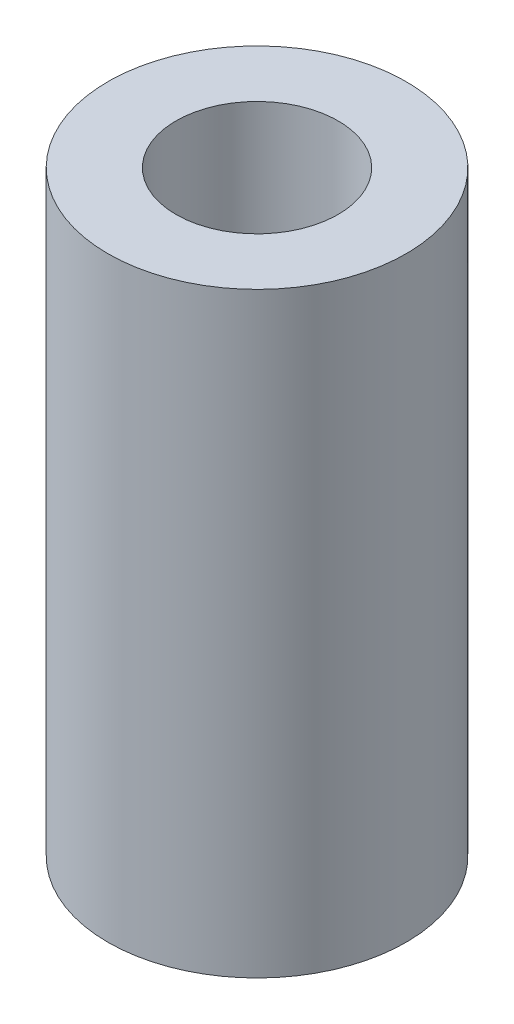
ISO-10303-21;
HEADER;
FILE_DESCRIPTION(('STEP AP214'),'2;1');
FILE_NAME('part.step','',(''),(''),'','','');
FILE_SCHEMA(('AUTOMOTIVE_DESIGN { 1 0 10303 214 1 1 1 1 }'));
ENDSEC;
DATA;
#1=APPLICATION_CONTEXT('core data for automotive mechanical design processes');
#2=APPLICATION_PROTOCOL_DEFINITION('international standard','automotive_design',2000,#1);
#3=PRODUCT_CONTEXT('',#1,'mechanical');
#4=PRODUCT('Part','Part','',(#3));
#5=PRODUCT_RELATED_PRODUCT_CATEGORY('part','',(#4));
#6=PRODUCT_DEFINITION_FORMATION('','',#4);
#7=PRODUCT_DEFINITION_CONTEXT('part definition',#1,'design');
#8=PRODUCT_DEFINITION('design','',#6,#7);
#9=PRODUCT_DEFINITION_SHAPE('','',#8);
#10=(LENGTH_UNIT() NAMED_UNIT(*) SI_UNIT(.MILLI.,.METRE.));
#11=(NAMED_UNIT(*) PLANE_ANGLE_UNIT() SI_UNIT($,.RADIAN.));
#12=(NAMED_UNIT(*) SI_UNIT($,.STERADIAN.) SOLID_ANGLE_UNIT());
#13=UNCERTAINTY_MEASURE_WITH_UNIT(LENGTH_MEASURE(1.E-05),#10,'distance_accuracy_value','');
#14=(GEOMETRIC_REPRESENTATION_CONTEXT(3) GLOBAL_UNCERTAINTY_ASSIGNED_CONTEXT((#13)) GLOBAL_UNIT_ASSIGNED_CONTEXT((#10,
#11,#12)) REPRESENTATION_CONTEXT('',''));
#15=CARTESIAN_POINT('',(0.,0.,0.));
#16=DIRECTION('',(0.,0.,1.));
#17=DIRECTION('',(1.,0.,0.));
#18=AXIS2_PLACEMENT_3D('',#15,#16,#17);
#19=CARTESIAN_POINT('',(0.,12.7,0.));
#20=DIRECTION('',(0.,-1.,0.));
#21=DIRECTION('',(0.,0.,-1.));
#22=AXIS2_PLACEMENT_3D('',#19,#20,#21);
#23=CYLINDRICAL_SURFACE('',#22,3.175);
#24=CARTESIAN_POINT('',(0.,12.7,0.));
#25=DIRECTION('',(0.,1.,0.));
#26=DIRECTION('',(0.,0.,1.));
#27=AXIS2_PLACEMENT_3D('',#24,#25,#26);
#28=CIRCLE('',#27,3.175);
#29=CARTESIAN_POINT('',(0.,12.7,3.175));
#30=VERTEX_POINT('',#29);
#31=EDGE_CURVE('E10',#30,#30,#28,.T.);
#32=ORIENTED_EDGE('',*,*,#31,.F.);
#33=EDGE_LOOP('',(#32));
#34=FACE_BOUND('',#33,.T.);
#35=CARTESIAN_POINT('',(0.,0.,0.));
#36=DIRECTION('',(0.,1.,0.));
#37=DIRECTION('',(0.,0.,1.));
#38=AXIS2_PLACEMENT_3D('',#35,#36,#37);
#39=CIRCLE('',#38,3.175);
#40=CARTESIAN_POINT('',(0.,0.,3.175));
#41=VERTEX_POINT('',#40);
#42=EDGE_CURVE('E44',#41,#41,#39,.T.);
#43=ORIENTED_EDGE('',*,*,#42,.T.);
#44=EDGE_LOOP('',(#43));
#45=FACE_BOUND('',#44,.T.);
#46=ADVANCED_FACE('F40',(#34,#45),#23,.T.);
#47=CARTESIAN_POINT('',(0.,12.7,0.));
#48=DIRECTION('',(0.,1.,0.));
#49=DIRECTION('',(0.,0.,1.));
#50=AXIS2_PLACEMENT_3D('',#47,#48,#49);
#51=PLANE('',#50);
#52=CARTESIAN_POINT('',(0.,12.700012,0.));
#53=DIRECTION('',(0.,1.,0.));
#54=DIRECTION('',(0.,0.,1.));
#55=AXIS2_PLACEMENT_3D('',#52,#53,#54);
#56=CIRCLE('',#55,1.7272);
#57=CARTESIAN_POINT('',(0.,12.700012,1.7272));
#58=VERTEX_POINT('',#57);
#59=EDGE_CURVE('E49',#58,#58,#56,.T.);
#60=ORIENTED_EDGE('',*,*,#59,.F.);
#61=EDGE_LOOP('',(#60));
#62=FACE_BOUND('',#61,.T.);
#63=ORIENTED_EDGE('',*,*,#31,.T.);
#64=EDGE_LOOP('',(#63));
#65=FACE_BOUND('',#64,.T.);
#66=ADVANCED_FACE('F66',(#62,#65),#51,.T.);
#67=CARTESIAN_POINT('',(0.,0.,0.));
#68=DIRECTION('',(0.,1.,0.));
#69=DIRECTION('',(0.,0.,1.));
#70=AXIS2_PLACEMENT_3D('',#67,#68,#69);
#71=PLANE('',#70);
#72=CARTESIAN_POINT('',(0.,0.,1.7272));
#73=CARTESIAN_POINT('',(0.028484275537845,0.,1.72720220619767));
#74=CARTESIAN_POINT('',(0.0569699872239295,0.,1.72652120642082));
#75=CARTESIAN_POINT('',(0.113673965070922,0.,1.72377986229577));
#76=CARTESIAN_POINT('',(0.141892703474904,0.,1.72172924953787));
#77=CARTESIAN_POINT('',(0.198063089875864,0.,1.71624920257882));
#78=CARTESIAN_POINT('',(0.226015369805878,0.,1.71282627006574));
#79=CARTESIAN_POINT('',(0.281652520269238,0.,1.70460561640287));
#80=CARTESIAN_POINT('',(0.309337852608635,0.,1.69981102202466));
#81=CARTESIAN_POINT('',(0.364441385642307,0.,1.68885025387632));
#82=CARTESIAN_POINT('',(0.391859532188237,0.,1.68268380787975));
#83=CARTESIAN_POINT('',(0.446429292224726,0.,1.66898292472));
#84=CARTESIAN_POINT('',(0.473580001915824,0.,1.66144488967167));
#85=CARTESIAN_POINT('',(0.527615675721411,0.,1.64500367419892));
#86=CARTESIAN_POINT('',(0.554498582502845,0.,1.63609373747535));
#87=CARTESIAN_POINT('',(0.608000334679664,0.,1.61691352434189));
#88=CARTESIAN_POINT('',(0.634615717422573,0.,1.60663360178212));
#89=CARTESIAN_POINT('',(0.687273231811043,0.,1.58483766864837));
#90=CARTESIAN_POINT('',(0.713316403308005,0.,1.57332417085226));
#91=CARTESIAN_POINT('',(0.764631292474234,0.,1.54911787602038));
#92=CARTESIAN_POINT('',(0.789907075668201,0.,1.53643370735223));
#93=CARTESIAN_POINT('',(0.839688513698609,0.,1.50989083621937));
#94=CARTESIAN_POINT('',(0.864197121502292,0.,1.49603767416901));
#95=CARTESIAN_POINT('',(0.912445271267489,0.,1.46715951288037));
#96=CARTESIAN_POINT('',(0.936186299502748,0.,1.45213699746058));
#97=CARTESIAN_POINT('',(0.982900843315734,0.,1.42092329914151));
#98=CARTESIAN_POINT('',(1.00587405046763,0.,1.40473165467611));
#99=CARTESIAN_POINT('',(1.05105489802664,0.,1.3711827197533));
#100=CARTESIAN_POINT('',(1.07326015816508,0.,1.35382222459714));
#101=CARTESIAN_POINT('',(1.11690687781073,0.,1.31793786251586));
#102=CARTESIAN_POINT('',(1.13834367208638,0.,1.29940832390386));
#103=CARTESIAN_POINT('',(1.18045711691101,0.,1.26118991252391));
#104=CARTESIAN_POINT('',(1.20112669461433,0.,1.24149325266008));
#105=CARTESIAN_POINT('',(1.24144857078835,0.,1.20119078561339));
#106=CARTESIAN_POINT('',(1.26110346036623,0.,1.18058757126251));
#107=CARTESIAN_POINT('',(1.29924900534445,0.,1.13858662981579));
#108=CARTESIAN_POINT('',(1.31774672013477,0.,1.11719531988086));
#109=CARTESIAN_POINT('',(1.35358122365416,0.,1.07362234187579));
#110=CARTESIAN_POINT('',(1.37092286055021,0.,1.05144466218631));
#111=CARTESIAN_POINT('',(1.40444715302777,0.,1.00630096076452));
#112=CARTESIAN_POINT('',(1.4206321322932,0.,0.983336665038701));
#113=CARTESIAN_POINT('',(1.45184577575755,0.,0.936622083840781));
#114=CARTESIAN_POINT('',(1.46687397837598,0.,0.912871489968184));
#115=CARTESIAN_POINT('',(1.49577701772701,0.,0.86458635443091));
#116=CARTESIAN_POINT('',(1.50964842899003,0.,0.8400497628971));
#117=CARTESIAN_POINT('',(1.53624038892102,0.,0.790194058586594));
#118=CARTESIAN_POINT('',(1.54895445701792,0.,0.764871491162768));
#119=CARTESIAN_POINT('',(1.57323665393217,0.,0.713446165553083));
#120=CARTESIAN_POINT('',(1.58479526829904,0.,0.687338919689012));
#121=CARTESIAN_POINT('',(1.60662473797475,0.,0.634673781289499));
#122=CARTESIAN_POINT('',(1.61689897938826,0.,0.608117292644625));
#123=CARTESIAN_POINT('',(1.63606780321785,0.,0.554715814417183));
#124=CARTESIAN_POINT('',(1.64497136340103,0.,0.527874052006689));
#125=CARTESIAN_POINT('',(1.66140347097813,0.,0.473904598652501));
#126=CARTESIAN_POINT('',(1.66893802378147,0.,0.446778737178888));
#127=CARTESIAN_POINT('',(1.68263468483387,0.,0.392242204100784));
#128=CARTESIAN_POINT('',(1.68879960040104,0.,0.36483223788303));
#129=CARTESIAN_POINT('',(1.69976035045847,0.,0.30972864822682));
#130=CARTESIAN_POINT('',(1.70455564048422,0.,0.282034916502664));
#131=CARTESIAN_POINT('',(1.71278064556841,0.,0.226364553750628));
#132=CARTESIAN_POINT('',(1.71620641145465,0.,0.198387339761069));
#133=CARTESIAN_POINT('',(1.72169522691572,0.,0.142150372469959));
#134=CARTESIAN_POINT('',(1.72375096718736,0.,0.113889907497812));
#135=CARTESIAN_POINT('',(1.72650517180604,0.,0.0570867072538034));
#136=CARTESIAN_POINT('',(1.72719312858692,0.,0.0285434669304571));
#137=CARTESIAN_POINT('',(1.72720685289717,0.,-0.028466552895922));
#138=CARTESIAN_POINT('',(1.72653628602502,0.,-0.0569333311793562));
#139=CARTESIAN_POINT('',(1.72381010904203,0.,-0.113605455217036));
#140=CARTESIAN_POINT('',(1.72176402829178,0.,-0.141811255095787));
#141=CARTESIAN_POINT('',(1.71629210050584,0.,-0.197960823759135));
#142=CARTESIAN_POINT('',(1.71287250185289,0.,-0.225905200504458));
#143=CARTESIAN_POINT('',(1.70465633899532,0.,-0.281531872452915));
#144=CARTESIAN_POINT('',(1.69986263835427,0.,-0.309214590277807));
#145=CARTESIAN_POINT('',(1.68890182016803,0.,-0.364318166382356));
#146=CARTESIAN_POINT('',(1.68273415816408,0.,-0.391738916347403));
#147=CARTESIAN_POINT('',(1.6690289465172,0.,-0.446319198238326));
#148=CARTESIAN_POINT('',(1.66148752522514,0.,-0.473477757467798));
#149=CARTESIAN_POINT('',(1.64503757381859,0.,-0.527534419258829));
#150=CARTESIAN_POINT('',(1.63612201844394,0.,-0.554430382169051));
#151=CARTESIAN_POINT('',(1.61692892808079,0.,-0.607963684732552));
#152=CARTESIAN_POINT('',(1.60664149209214,0.,-0.634597469921074));
#153=CARTESIAN_POINT('',(1.58483738163512,0.,-0.687273112452879));
#154=CARTESIAN_POINT('',(1.57332409420488,0.,-0.713316371433206));
#155=CARTESIAN_POINT('',(1.54911795214215,0.,-0.764631324130464));
#156=CARTESIAN_POINT('',(1.53643372770493,0.,-0.789907084132143));
#157=CARTESIAN_POINT('',(1.50989081595821,0.,-0.83968850527276));
#158=CARTESIAN_POINT('',(1.49603766874515,0.,-0.864197119246723));
#159=CARTESIAN_POINT('',(1.46715951829298,0.,-0.912445273518414));
#160=CARTESIAN_POINT('',(1.4521369989113,0.,-0.936186300106067));
#161=CARTESIAN_POINT('',(1.42092329769018,0.,-0.982900842712199));
#162=CARTESIAN_POINT('',(1.40473165428663,0.,-1.00587405030568));
#163=CARTESIAN_POINT('',(1.37118272014387,0.,-1.05105489818908));
#164=CARTESIAN_POINT('',(1.35382222470206,0.,-1.07326015820873));
#165=CARTESIAN_POINT('',(1.31793786241035,0.,-1.11690687776686));
#166=CARTESIAN_POINT('',(1.29940832387549,0.,-1.13834367207459));
#167=CARTESIAN_POINT('',(1.26118991255249,0.,-1.1804571169229));
#168=CARTESIAN_POINT('',(1.24149325266773,0.,-1.20112669461751));
#169=CARTESIAN_POINT('',(1.20119078560576,0.,-1.24144857078518));
#170=CARTESIAN_POINT('',(1.18058757126048,0.,-1.26110346036538));
#171=CARTESIAN_POINT('',(1.13858662981782,0.,-1.29924900534529));
#172=CARTESIAN_POINT('',(1.11719531988141,0.,-1.31774672013498));
#173=CARTESIAN_POINT('',(1.07362234187526,0.,-1.35358122365393));
#174=CARTESIAN_POINT('',(1.05144466218618,0.,-1.37092286055014));
#175=CARTESIAN_POINT('',(1.00630096076467,0.,-1.40444715302782));
#176=CARTESIAN_POINT('',(0.983336665038751,0.,-1.4206321322932));
#177=CARTESIAN_POINT('',(0.936622083840755,0.,-1.45184577575752));
#178=CARTESIAN_POINT('',(0.912871489968186,0.,-1.46687397837596));
#179=CARTESIAN_POINT('',(0.864586354430931,0.,-1.495777017727));
#180=CARTESIAN_POINT('',(0.840049762897113,0.,-1.50964842899002));
#181=CARTESIAN_POINT('',(0.790194058586599,0.,-1.53624038892101));
#182=CARTESIAN_POINT('',(0.764871491162774,0.,-1.54895445701791));
#183=CARTESIAN_POINT('',(0.713446165553088,0.,-1.57323665393216));
#184=CARTESIAN_POINT('',(0.687338919689014,0.,-1.58479526829904));
#185=CARTESIAN_POINT('',(0.634673781289501,0.,-1.60662473797475));
#186=CARTESIAN_POINT('',(0.60811729264463,0.,-1.61689897938826));
#187=CARTESIAN_POINT('',(0.554715814417192,0.,-1.63606780321785));
#188=CARTESIAN_POINT('',(0.527874052006701,0.,-1.64497136340103));
#189=CARTESIAN_POINT('',(0.473904598652516,0.,-1.66140347097813));
#190=CARTESIAN_POINT('',(0.446778737178904,0.,-1.66893802378147));
#191=CARTESIAN_POINT('',(0.392242204100801,0.,-1.68263468483387));
#192=CARTESIAN_POINT('',(0.364832237883048,0.,-1.68879960040104));
#193=CARTESIAN_POINT('',(0.309728648226838,0.,-1.69976035045847));
#194=CARTESIAN_POINT('',(0.282034916502681,0.,-1.70455564048422));
#195=CARTESIAN_POINT('',(0.226364553750644,0.,-1.71278064556841));
#196=CARTESIAN_POINT('',(0.198387339761084,0.,-1.71620641145465));
#197=CARTESIAN_POINT('',(0.14215037246997,0.,-1.72169522691572));
#198=CARTESIAN_POINT('',(0.113889907497822,0.,-1.72375096718736));
#199=CARTESIAN_POINT('',(0.0570867072538087,0.,-1.72650517180604));
#200=CARTESIAN_POINT('',(0.0285434669304598,0.,-1.72719312858692));
#201=CARTESIAN_POINT('',(-0.0284665528959136,0.,-1.72720685289717));
#202=CARTESIAN_POINT('',(-0.0569333311793397,0.,-1.72653628602502));
#203=CARTESIAN_POINT('',(-0.113605455217005,0.,-1.72381010904203));
#204=CARTESIAN_POINT('',(-0.141811255095751,0.,-1.72176402829178));
#205=CARTESIAN_POINT('',(-0.197960823759089,0.,-1.71629210050584));
#206=CARTESIAN_POINT('',(-0.225905200504409,0.,-1.71287250185289));
#207=CARTESIAN_POINT('',(-0.281531872452861,0.,-1.70465633899532));
#208=CARTESIAN_POINT('',(-0.309214590277752,0.,-1.69986263835427));
#209=CARTESIAN_POINT('',(-0.364318166382301,0.,-1.68890182016803));
#210=CARTESIAN_POINT('',(-0.39173891634735,0.,-1.68273415816408));
#211=CARTESIAN_POINT('',(-0.446319198238277,0.,-1.6690289465172));
#212=CARTESIAN_POINT('',(-0.473477757467752,0.,-1.66148752522514));
#213=CARTESIAN_POINT('',(-0.527534419258793,0.,-1.64503757381859));
#214=CARTESIAN_POINT('',(-0.55443038216902,0.,-1.63612201844394));
#215=CARTESIAN_POINT('',(-0.607963684732535,0.,-1.61692892808079));
#216=CARTESIAN_POINT('',(-0.634597469921066,0.,-1.60664149209214));
#217=CARTESIAN_POINT('',(-0.687273112452882,0.,-1.58483738163513));
#218=CARTESIAN_POINT('',(-0.713316371433212,0.,-1.57332409420489));
#219=CARTESIAN_POINT('',(-0.764631324130476,0.,-1.54911795214216));
#220=CARTESIAN_POINT('',(-0.789907084132157,0.,-1.53643372770494));
#221=CARTESIAN_POINT('',(-0.839688505272777,0.,-1.50989081595823));
#222=CARTESIAN_POINT('',(-0.864197119246742,0.,-1.49603766874516));
#223=CARTESIAN_POINT('',(-0.912445273518434,0.,-1.467159518293));
#224=CARTESIAN_POINT('',(-0.936186300106088,0.,-1.45213699891132));
#225=CARTESIAN_POINT('',(-0.98290084271222,0.,-1.4209232976902));
#226=CARTESIAN_POINT('',(-1.0058740503057,0.,-1.40473165428665));
#227=CARTESIAN_POINT('',(-1.0510548981891,0.,-1.37118272014388));
#228=CARTESIAN_POINT('',(-1.07326015820875,0.,-1.35382222470208));
#229=CARTESIAN_POINT('',(-1.11690687776688,0.,-1.31793786241036));
#230=CARTESIAN_POINT('',(-1.13834367207461,0.,-1.2994083238755));
#231=CARTESIAN_POINT('',(-1.1804571169229,0.,-1.26118991255249));
#232=CARTESIAN_POINT('',(-1.20112669461751,0.,-1.24149325266773));
#233=CARTESIAN_POINT('',(-1.24144857078518,0.,-1.20119078560576));
#234=CARTESIAN_POINT('',(-1.26110346036538,0.,-1.18058757126047));
#235=CARTESIAN_POINT('',(-1.29924900534528,0.,-1.13858662981781));
#236=CARTESIAN_POINT('',(-1.31774672013498,0.,-1.11719531988139));
#237=CARTESIAN_POINT('',(-1.35358122365392,0.,-1.07362234187524));
#238=CARTESIAN_POINT('',(-1.37092286055013,0.,-1.05144466218616));
#239=CARTESIAN_POINT('',(-1.40444715302781,0.,-1.00630096076465));
#240=CARTESIAN_POINT('',(-1.42063213229319,0.,-0.983336665038725));
#241=CARTESIAN_POINT('',(-1.45184577575751,0.,-0.936622083840728));
#242=CARTESIAN_POINT('',(-1.46687397837595,0.,-0.91287148996816));
#243=CARTESIAN_POINT('',(-1.49577701772699,0.,-0.864586354430908));
#244=CARTESIAN_POINT('',(-1.50964842899001,0.,-0.840049762897091));
#245=CARTESIAN_POINT('',(-1.536240388921,0.,-0.790194058586582));
#246=CARTESIAN_POINT('',(-1.5489544570179,0.,-0.76487149116276));
#247=CARTESIAN_POINT('',(-1.57323665393216,0.,-0.713446165553081));
#248=CARTESIAN_POINT('',(-1.58479526829904,0.,-0.687338919689011));
#249=CARTESIAN_POINT('',(-1.60662473797475,0.,-0.634673781289509));
#250=CARTESIAN_POINT('',(-1.61689897938826,0.,-0.608117292644645));
#251=CARTESIAN_POINT('',(-1.63606780321785,0.,-0.554715814417219));
#252=CARTESIAN_POINT('',(-1.64497136340103,0.,-0.527874052006732));
#253=CARTESIAN_POINT('',(-1.66140347097813,0.,-0.473904598652554));
#254=CARTESIAN_POINT('',(-1.66893802378147,0.,-0.446778737178945));
#255=CARTESIAN_POINT('',(-1.68263468483387,0.,-0.392242204100846));
#256=CARTESIAN_POINT('',(-1.68879960040104,0.,-0.364832237883094));
#257=CARTESIAN_POINT('',(-1.69976035045847,0.,-0.309728648226884));
#258=CARTESIAN_POINT('',(-1.70455564048422,0.,-0.282034916502726));
#259=CARTESIAN_POINT('',(-1.71278064556841,0.,-0.226364553750685));
#260=CARTESIAN_POINT('',(-1.71620641145465,0.,-0.198387339761122));
#261=CARTESIAN_POINT('',(-1.72169522691572,0.,-0.14215037247));
#262=CARTESIAN_POINT('',(-1.72375096718736,0.,-0.113889907497848));
#263=CARTESIAN_POINT('',(-1.72650517180604,0.,-0.0570867072538224));
#264=CARTESIAN_POINT('',(-1.72719312858692,0.,-0.0285434669304667));
#265=CARTESIAN_POINT('',(-1.72720685289717,0.,0.0284665528959201));
#266=CARTESIAN_POINT('',(-1.72653628602502,0.,0.0569333311793526));
#267=CARTESIAN_POINT('',(-1.72381010904203,0.,0.113605455217029));
#268=CARTESIAN_POINT('',(-1.72176402829178,0.,0.141811255095779));
#269=CARTESIAN_POINT('',(-1.71629210050584,0.,0.197960823759125));
#270=CARTESIAN_POINT('',(-1.71287250185289,0.,0.225905200504448));
#271=CARTESIAN_POINT('',(-1.70465633899532,0.,0.281531872452903));
#272=CARTESIAN_POINT('',(-1.69986263835427,0.,0.309214590277796));
#273=CARTESIAN_POINT('',(-1.68890182016803,0.,0.364318166382345));
#274=CARTESIAN_POINT('',(-1.68273415816408,0.,0.391738916347392));
#275=CARTESIAN_POINT('',(-1.6690289465172,0.,0.446319198238316));
#276=CARTESIAN_POINT('',(-1.66148752522514,0.,0.473477757467788));
#277=CARTESIAN_POINT('',(-1.64503757381859,0.,0.527534419258822));
#278=CARTESIAN_POINT('',(-1.63612201844394,0.,0.554430382169045));
#279=CARTESIAN_POINT('',(-1.61692892808079,0.,0.607963684732549));
#280=CARTESIAN_POINT('',(-1.60664149209214,0.,0.634597469921073));
#281=CARTESIAN_POINT('',(-1.58483738163512,0.,0.687273112452888));
#282=CARTESIAN_POINT('',(-1.57332409420488,0.,0.713316371433222));
#283=CARTESIAN_POINT('',(-1.54911795214214,0.,0.764631324130492));
#284=CARTESIAN_POINT('',(-1.53643372770492,0.,0.789907084132175));
#285=CARTESIAN_POINT('',(-1.5098908159582,0.,0.839688505272806));
#286=CARTESIAN_POINT('',(-1.49603766874514,0.,0.86419711924678));
#287=CARTESIAN_POINT('',(-1.46715951829296,0.,0.912445273518454));
#288=CARTESIAN_POINT('',(-1.45213699891127,0.,0.93618630010608));
#289=CARTESIAN_POINT('',(-1.42092329769018,0.,0.98290084271229));
#290=CARTESIAN_POINT('',(-1.40473165428668,0.,1.00587405030587));
#291=CARTESIAN_POINT('',(-1.3711827201438,0.,1.05105489818898));
#292=CARTESIAN_POINT('',(-1.35382222470183,0.,1.07326015820823));
#293=CARTESIAN_POINT('',(-1.31793786241057,0.,1.11690687776744));
#294=CARTESIAN_POINT('',(-1.29940832387633,0.,1.13834367207666));
#295=CARTESIAN_POINT('',(-1.26118991255162,0.,1.18045711692085));
#296=CARTESIAN_POINT('',(-1.24149325266452,0.,1.20112669460981));
#297=CARTESIAN_POINT('',(-1.20119078560896,0.,1.24144857079286));
#298=CARTESIAN_POINT('',(-1.18058757127241,0.,1.26110346039402));
#299=CARTESIAN_POINT('',(-1.13858662980595,0.,1.29924900531684));
#300=CARTESIAN_POINT('',(-1.11719531983727,0.,1.31774672002915));
#301=CARTESIAN_POINT('',(-1.07362234191916,0.,1.35358122375927));
#302=CARTESIAN_POINT('',(-1.05144466234969,0.,1.37092286094238));
#303=CARTESIAN_POINT('',(-1.00630096060145,0.,1.40444715263637));
#304=CARTESIAN_POINT('',(-0.983336664430356,0.,1.42063213083397));
#305=CARTESIAN_POINT('',(-0.936622084449338,0.,1.45184577721731));
#306=CARTESIAN_POINT('',(-0.912871492239759,0.,1.46687398382457));
#307=CARTESIAN_POINT('',(-0.864586352152804,0.,1.49577701226278));
#308=CARTESIAN_POINT('',(-0.840049754383732,0.,1.50964840857002));
#309=CARTESIAN_POINT('',(-0.790194067145004,0.,1.53624040944908));
#310=CARTESIAN_POINT('',(-0.76487152318477,0.,1.54895453382533));
#311=CARTESIAN_POINT('',(-0.713446133286007,0.,1.57323657653693));
#312=CARTESIAN_POINT('',(-0.687338798816759,0.,1.58479497837698));
#313=CARTESIAN_POINT('',(-0.634655509343009,0.,1.60663265096072));
#314=CARTESIAN_POINT('',(-0.608080594345467,0.,1.61691443015357));
#315=CARTESIAN_POINT('',(-0.554647523139008,0.,1.63609617178356));
#316=CARTESIAN_POINT('',(-0.527792686925318,0.,1.64500536933098));
#317=CARTESIAN_POINT('',(-0.47380221876541,0.,1.66144623646639));
#318=CARTESIAN_POINT('',(-0.446668498928961,0.,1.66898418156056));
#319=CARTESIAN_POINT('',(-0.392121425106505,0.,1.68268519626112));
#320=CARTESIAN_POINT('',(-0.364708845592316,0.,1.6888513476097));
#321=CARTESIAN_POINT('',(-0.309605229939729,0.,1.69981210344328));
#322=CARTESIAN_POINT('',(-0.281914139655217,0.,1.70460643567672));
#323=CARTESIAN_POINT('',(-0.226254204910725,0.,1.71282710224688));
#324=CARTESIAN_POINT('',(-0.198284816315596,0.,1.71624975051056));
#325=CARTESIAN_POINT('',(-0.142068936405041,0.,1.72172979957861));
#326=CARTESIAN_POINT('',(-0.113821759412477,0.,1.72378013810032));
#327=CARTESIAN_POINT('',(-0.0570495460671742,0.,1.72652147049417));
#328=CARTESIAN_POINT('',(-0.0285240113893945,0.,1.72720218538242));
#329=CARTESIAN_POINT('',(0.,0.,1.7272));
#330=B_SPLINE_CURVE_WITH_KNOTS('',3,(#72,#73,#74,#75,#76,#77,#78,#79,#80,#81,#82,#83,#84,#85,
#86,#87,#88,#89,#90,#91,#92,#93,#94,#95,#96,#97,#98,#99,#100,#101,#102,#103,#104,#105,#106,#107,
#108,#109,#110,#111,#112,#113,#114,#115,#116,#117,#118,#119,#120,#121,#122,#123,#124,#125,#126,
#127,#128,#129,#130,#131,#132,#133,#134,#135,#136,#137,#138,#139,#140,#141,#142,#143,#144,#145,
#146,#147,#148,#149,#150,#151,#152,#153,#154,#155,#156,#157,#158,#159,#160,#161,#162,#163,#164,
#165,#166,#167,#168,#169,#170,#171,#172,#173,#174,#175,#176,#177,#178,#179,#180,#181,#182,#183,
#184,#185,#186,#187,#188,#189,#190,#191,#192,#193,#194,#195,#196,#197,#198,#199,#200,#201,#202,
#203,#204,#205,#206,#207,#208,#209,#210,#211,#212,#213,#214,#215,#216,#217,#218,#219,#220,#221,
#222,#223,#224,#225,#226,#227,#228,#229,#230,#231,#232,#233,#234,#235,#236,#237,#238,#239,#240,
#241,#242,#243,#244,#245,#246,#247,#248,#249,#250,#251,#252,#253,#254,#255,#256,#257,#258,#259,
#260,#261,#262,#263,#264,#265,#266,#267,#268,#269,#270,#271,#272,#273,#274,#275,#276,#277,#278,
#279,#280,#281,#282,#283,#284,#285,#286,#287,#288,#289,#290,#291,#292,#293,#294,#295,#296,#297,
#298,#299,#300,#301,#302,#303,#304,#305,#306,#307,#308,#309,#310,#311,#312,#313,#314,#315,#316,
#317,#318,#319,#320,#321,#322,#323,#324,#325,#326,#327,#328,#329),.UNSPECIFIED.,.F.,.F.,(4,2,2,
2,2,2,2,2,2,2,2,2,2,2,2,2,2,2,2,2,2,2,2,2,2,2,2,2,2,2,2,2,2,2,2,2,2,2,2,2,2,2,2,2,2,2,2,2,2,2,2,
2,2,2,2,2,2,2,2,2,2,2,2,2,2,2,2,2,2,2,2,2,2,2,2,2,2,2,2,2,2,2,2,2,2,2,2,2,2,2,2,2,2,2,2,2,2,2,2,
2,2,2,2,2,2,2,2,2,2,2,2,2,2,2,2,2,2,2,2,2,2,2,2,2,2,2,2,2,4),(0.,0.0854466948841432,
0.170292629226427,0.254741248488874,0.338998876211113,0.423273238721622,0.50777193892969,
0.592700934627747,0.678263076354304,0.763654128488218,0.848459618038606,0.932883604114594,
1.01713291797393,1.10141567682955,1.1859397508475,1.27091123918684,1.35653301017032,
1.44192406230425,1.52672955185466,1.61115353793066,1.69540285179,1.77968561064561,
1.86420968466355,1.94918117300288,2.03480294398634,2.1201939961203,2.20499948567072,
2.28942347174673,2.37367278560608,2.45795554446169,2.54247961847962,2.62745110681892,
2.71307287780235,2.7984639299363,2.88326941948671,2.96769340556272,3.05194271942206,
3.13622547827767,3.22074955229561,3.30572104063492,3.39134281161836,3.47673386375228,
3.56153935330268,3.64596333937867,3.73021265323801,3.81449541209363,3.89901948611157,
3.98399097445091,4.06961274543437,4.1550037975683,4.2398092871187,4.3242332731947,
4.40848258705404,4.49276534590965,4.5772894199276,4.66226090826693,4.74788267925039,
4.83327373138435,4.91807922093477,5.00250320701077,5.08675252087012,5.17103527972573,
5.25555935374366,5.34053084208297,5.42615261306641,5.51154366520033,5.59634915475073,
5.68077314082672,5.76502245468606,5.84930521354168,5.93382928755962,6.01880077589895,
6.10442254688242,6.18981359901634,6.27461908856674,6.35904307464274,6.44329238850208,
6.52757514735769,6.61209922137564,6.69707070971497,6.78269248069844,6.86808353283237,
6.95288902238278,7.03731300845877,7.12156232231812,7.20584508117373,7.29036915519167,
7.375340643531,7.46096241451445,7.54635346664839,7.63115895619879,7.71558294227479,
7.79983225613413,7.88411501498975,7.96863908900769,8.05361057734701,8.13923234833047,
8.22462340046441,8.30942889001482,8.39385287609082,8.47810218995017,8.56238494880578,
8.64690902282371,8.73188051116303,8.81750228214648,8.90289333428042,8.98769882383083,
9.07212280990684,9.15637212376618,9.24065488262179,9.32517895663973,9.41015044497905,
9.4957722159625,9.58116326809643,9.66596875764684,9.75039274372283,9.83464205758217,
9.91892481643779,10.0034488904557,10.088420378795,10.1740421497785,10.2594929257957,
10.3443409745265,10.4287903732498,10.5130480959572,10.5973225288937,10.6818219346757,
10.7667529209414,10.8523189691056),.UNSPECIFIED.);
#331=CARTESIAN_POINT('',(0.,0.,1.7272));
#332=VERTEX_POINT('',#331);
#333=EDGE_CURVE('E147',#332,#332,#330,.T.);
#334=ORIENTED_EDGE('',*,*,#333,.T.);
#335=EDGE_LOOP('',(#334));
#336=FACE_BOUND('',#335,.T.);
#337=ORIENTED_EDGE('',*,*,#42,.F.);
#338=EDGE_LOOP('',(#337));
#339=FACE_BOUND('',#338,.T.);
#340=ADVANCED_FACE('F74',(#336,#339),#71,.F.);
#341=CARTESIAN_POINT('',(0.,12.700012,0.));
#342=DIRECTION('',(0.,-1.,0.));
#343=DIRECTION('',(0.,0.,-1.));
#344=AXIS2_PLACEMENT_3D('',#341,#342,#343);
#345=CYLINDRICAL_SURFACE('',#344,1.7272);
#346=ORIENTED_EDGE('',*,*,#59,.T.);
#347=EDGE_LOOP('',(#346));
#348=FACE_BOUND('',#347,.T.);
#349=CARTESIAN_POINT('',(0.,8.73125,0.));
#350=DIRECTION('',(0.,1.,0.));
#351=DIRECTION('',(0.,0.,1.));
#352=AXIS2_PLACEMENT_3D('',#349,#350,#351);
#353=CIRCLE('',#352,1.7272);
#354=CARTESIAN_POINT('',(0.,8.73125,1.7272));
#355=VERTEX_POINT('',#354);
#356=EDGE_CURVE('E141',#355,#355,#353,.T.);
#357=ORIENTED_EDGE('',*,*,#356,.F.);
#358=EDGE_LOOP('',(#357));
#359=FACE_BOUND('',#358,.T.);
#360=ADVANCED_FACE('F73',(#348,#359),#345,.F.);
#361=CARTESIAN_POINT('',(0.,8.73125,0.));
#362=DIRECTION('',(0.,1.,0.));
#363=DIRECTION('',(0.,0.,1.));
#364=AXIS2_PLACEMENT_3D('',#361,#362,#363);
#365=PLANE('',#364);
#366=ORIENTED_EDGE('',*,*,#356,.T.);
#367=EDGE_LOOP('',(#366));
#368=FACE_BOUND('',#367,.T.);
#369=ADVANCED_FACE('F88',(#368),#365,.T.);
#370=CARTESIAN_POINT('',(0.,-1.2E-05,0.));
#371=DIRECTION('',(0.,1.,0.));
#372=DIRECTION('',(0.,0.,1.));
#373=AXIS2_PLACEMENT_3D('',#370,#371,#372);
#374=CYLINDRICAL_SURFACE('',#373,1.7272);
#375=ORIENTED_EDGE('',*,*,#333,.F.);
#376=EDGE_LOOP('',(#375));
#377=FACE_BOUND('',#376,.T.);
#378=CARTESIAN_POINT('',(0.,3.96875,0.));
#379=DIRECTION('',(0.,1.,0.));
#380=DIRECTION('',(0.,0.,1.));
#381=AXIS2_PLACEMENT_3D('',#378,#379,#380);
#382=CIRCLE('',#381,1.7272);
#383=CARTESIAN_POINT('',(0.,3.96875,1.7272));
#384=VERTEX_POINT('',#383);
#385=EDGE_CURVE('E153',#384,#384,#382,.T.);
#386=ORIENTED_EDGE('',*,*,#385,.T.);
#387=EDGE_LOOP('',(#386));
#388=FACE_BOUND('',#387,.T.);
#389=ADVANCED_FACE('F109',(#377,#388),#374,.F.);
#390=CARTESIAN_POINT('',(0.,3.96875,0.));
#391=DIRECTION('',(0.,-1.,0.));
#392=DIRECTION('',(0.,0.,1.));
#393=AXIS2_PLACEMENT_3D('',#390,#391,#392);
#394=PLANE('',#393);
#395=ORIENTED_EDGE('',*,*,#385,.F.);
#396=EDGE_LOOP('',(#395));
#397=FACE_BOUND('',#396,.T.);
#398=ADVANCED_FACE('F121',(#397),#394,.T.);
#399=CLOSED_SHELL('',(#46,#66,#340,#360,#369,#389,#398));
#400=MANIFOLD_SOLID_BREP('B2',#399);
#401=ADVANCED_BREP_SHAPE_REPRESENTATION('',(#18,#400),#14);
#402=SHAPE_DEFINITION_REPRESENTATION(#9,#401);
ENDSEC;
END-ISO-10303-21;
